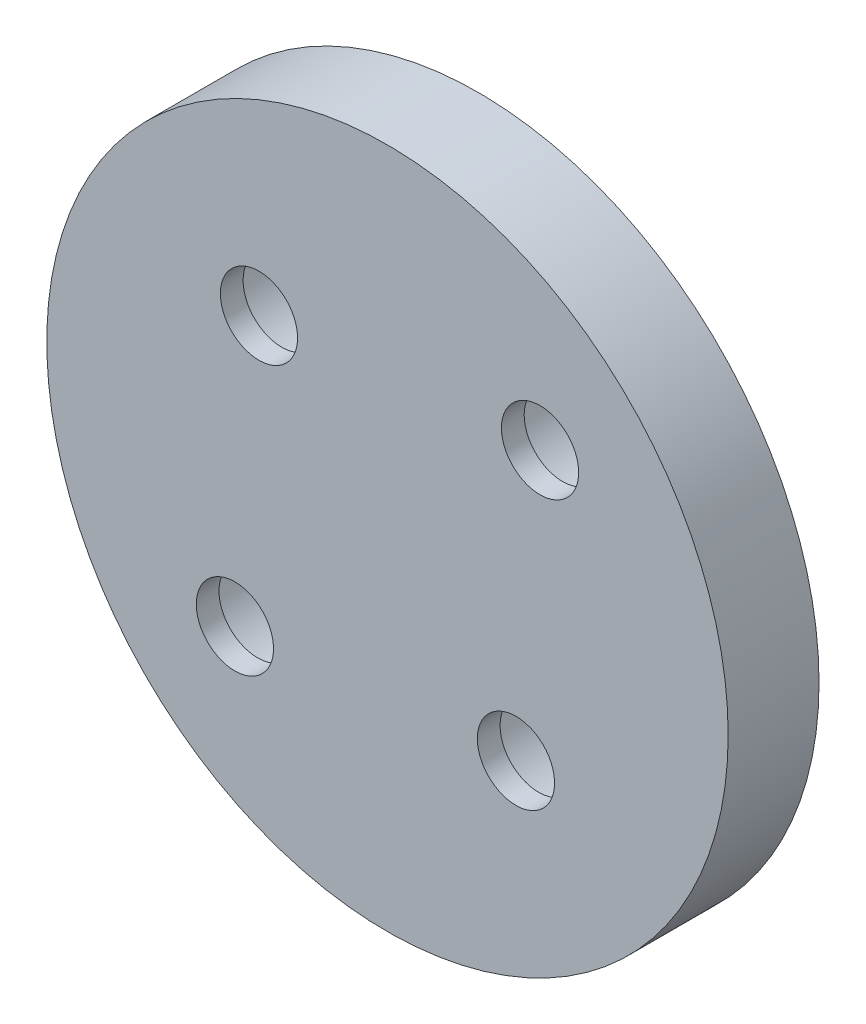
ISO-10303-21;
HEADER;
FILE_DESCRIPTION(('STEP AP214'),'2;1');
FILE_NAME('part.step','',(''),(''),'','','');
FILE_SCHEMA(('AUTOMOTIVE_DESIGN { 1 0 10303 214 1 1 1 1 }'));
ENDSEC;
DATA;
#1=APPLICATION_CONTEXT('core data for automotive mechanical design processes');
#2=APPLICATION_PROTOCOL_DEFINITION('international standard','automotive_design',2000,#1);
#3=PRODUCT_CONTEXT('',#1,'mechanical');
#4=PRODUCT('Part','Part','',(#3));
#5=PRODUCT_RELATED_PRODUCT_CATEGORY('part','',(#4));
#6=PRODUCT_DEFINITION_FORMATION('','',#4);
#7=PRODUCT_DEFINITION_CONTEXT('part definition',#1,'design');
#8=PRODUCT_DEFINITION('design','',#6,#7);
#9=PRODUCT_DEFINITION_SHAPE('','',#8);
#10=(LENGTH_UNIT() NAMED_UNIT(*) SI_UNIT(.MILLI.,.METRE.));
#11=(NAMED_UNIT(*) PLANE_ANGLE_UNIT() SI_UNIT($,.RADIAN.));
#12=(NAMED_UNIT(*) SI_UNIT($,.STERADIAN.) SOLID_ANGLE_UNIT());
#13=UNCERTAINTY_MEASURE_WITH_UNIT(LENGTH_MEASURE(1.E-05),#10,'distance_accuracy_value','');
#14=(GEOMETRIC_REPRESENTATION_CONTEXT(3) GLOBAL_UNCERTAINTY_ASSIGNED_CONTEXT((#13)) GLOBAL_UNIT_ASSIGNED_CONTEXT((#10,
#11,#12)) REPRESENTATION_CONTEXT('',''));
#15=CARTESIAN_POINT('',(0.,0.,0.));
#16=DIRECTION('',(0.,0.,1.));
#17=DIRECTION('',(1.,0.,0.));
#18=AXIS2_PLACEMENT_3D('',#15,#16,#17);
#19=CARTESIAN_POINT('',(1.5,-7.5,-2.));
#20=DIRECTION('',(0.,-1.,0.));
#21=DIRECTION('',(0.,0.,-1.));
#22=AXIS2_PLACEMENT_3D('',#19,#20,#21);
#23=PLANE('',#22);
#24=DIRECTION('',(-1.,0.,0.));
#25=VECTOR('',#24,1.);
#26=CARTESIAN_POINT('',(1.5,-7.5,-1.));
#27=LINE('',#26,#25);
#28=CARTESIAN_POINT('',(1.5,-7.5,-1.));
#29=VERTEX_POINT('',#28);
#30=CARTESIAN_POINT('',(0.499999999999999,-7.5,-1.));
#31=VERTEX_POINT('',#30);
#32=EDGE_CURVE('E103',#29,#31,#27,.T.);
#33=ORIENTED_EDGE('',*,*,#32,.T.);
#34=DIRECTION('',(0.,0.,1.));
#35=VECTOR('',#34,1.);
#36=CARTESIAN_POINT('',(0.499999999999999,-7.5,-1.));
#37=LINE('',#36,#35);
#38=CARTESIAN_POINT('',(0.499999999999999,-7.5,0.));
#39=VERTEX_POINT('',#38);
#40=EDGE_CURVE('E471',#31,#39,#37,.T.);
#41=ORIENTED_EDGE('',*,*,#40,.T.);
#42=DIRECTION('',(1.,0.,0.));
#43=VECTOR('',#42,1.);
#44=CARTESIAN_POINT('',(1.5,-7.5,0.));
#45=LINE('',#44,#43);
#46=CARTESIAN_POINT('',(-0.500000000000001,-7.5,0.));
#47=VERTEX_POINT('',#46);
#48=EDGE_CURVE('E130',#47,#39,#45,.T.);
#49=ORIENTED_EDGE('',*,*,#48,.F.);
#50=DIRECTION('',(0.,0.,1.));
#51=VECTOR('',#50,1.);
#52=CARTESIAN_POINT('',(-0.500000000000001,-7.5,-1.));
#53=LINE('',#52,#51);
#54=CARTESIAN_POINT('',(-0.500000000000001,-7.5,-1.));
#55=VERTEX_POINT('',#54);
#56=EDGE_CURVE('E495',#55,#47,#53,.T.);
#57=ORIENTED_EDGE('',*,*,#56,.F.);
#58=DIRECTION('',(-1.,0.,0.));
#59=VECTOR('',#58,1.);
#60=CARTESIAN_POINT('',(-1.5,-7.5,-1.));
#61=LINE('',#60,#59);
#62=CARTESIAN_POINT('',(-1.5,-7.5,-1.));
#63=VERTEX_POINT('',#62);
#64=EDGE_CURVE('E497',#55,#63,#61,.T.);
#65=ORIENTED_EDGE('',*,*,#64,.T.);
#66=DIRECTION('',(0.,0.,1.));
#67=VECTOR('',#66,1.);
#68=CARTESIAN_POINT('',(-1.5,-7.5,-2.));
#69=LINE('',#68,#67);
#70=CARTESIAN_POINT('',(-1.5,-7.5,-2.));
#71=VERTEX_POINT('',#70);
#72=EDGE_CURVE('E121',#71,#63,#69,.T.);
#73=ORIENTED_EDGE('',*,*,#72,.F.);
#74=DIRECTION('',(1.,0.,0.));
#75=VECTOR('',#74,1.);
#76=CARTESIAN_POINT('',(1.5,-7.5,-2.));
#77=LINE('',#76,#75);
#78=CARTESIAN_POINT('',(1.5,-7.5,-2.));
#79=VERTEX_POINT('',#78);
#80=EDGE_CURVE('E119',#71,#79,#77,.T.);
#81=ORIENTED_EDGE('',*,*,#80,.T.);
#82=DIRECTION('',(0.,0.,1.));
#83=VECTOR('',#82,1.);
#84=CARTESIAN_POINT('',(1.5,-7.5,-2.));
#85=LINE('',#84,#83);
#86=EDGE_CURVE('E59',#79,#29,#85,.T.);
#87=ORIENTED_EDGE('',*,*,#86,.T.);
#88=EDGE_LOOP('',(#33,#41,#49,#57,#65,#73,#81,#87));
#89=FACE_BOUND('',#88,.T.);
#90=ADVANCED_FACE('F34',(#89),#23,.T.);
#91=CARTESIAN_POINT('',(-1.5,7.5,-2.));
#92=DIRECTION('',(-1.,0.,0.));
#93=DIRECTION('',(0.,-1.,0.));
#94=AXIS2_PLACEMENT_3D('',#91,#92,#93);
#95=PLANE('',#94);
#96=ORIENTED_EDGE('',*,*,#72,.T.);
#97=DIRECTION('',(0.,1.,0.));
#98=VECTOR('',#97,1.);
#99=CARTESIAN_POINT('',(-1.5,7.5,-1.));
#100=LINE('',#99,#98);
#101=CARTESIAN_POINT('',(-1.5,7.5,-1.));
#102=VERTEX_POINT('',#101);
#103=EDGE_CURVE('E499',#63,#102,#100,.T.);
#104=ORIENTED_EDGE('',*,*,#103,.T.);
#105=DIRECTION('',(0.,0.,1.));
#106=VECTOR('',#105,1.);
#107=CARTESIAN_POINT('',(-1.5,7.5,-2.));
#108=LINE('',#107,#106);
#109=CARTESIAN_POINT('',(-1.5,7.5,-2.));
#110=VERTEX_POINT('',#109);
#111=EDGE_CURVE('E127',#110,#102,#108,.T.);
#112=ORIENTED_EDGE('',*,*,#111,.F.);
#113=DIRECTION('',(0.,-1.,0.));
#114=VECTOR('',#113,1.);
#115=CARTESIAN_POINT('',(-1.5,7.5,-2.));
#116=LINE('',#115,#114);
#117=EDGE_CURVE('E488',#110,#71,#116,.T.);
#118=ORIENTED_EDGE('',*,*,#117,.T.);
#119=EDGE_LOOP('',(#96,#104,#112,#118));
#120=FACE_BOUND('',#119,.T.);
#121=ADVANCED_FACE('F220',(#120),#95,.T.);
#122=CARTESIAN_POINT('',(1.5,7.5,-2.));
#123=DIRECTION('',(0.,1.,0.));
#124=DIRECTION('',(0.,0.,1.));
#125=AXIS2_PLACEMENT_3D('',#122,#123,#124);
#126=PLANE('',#125);
#127=DIRECTION('',(-1.,0.,0.));
#128=VECTOR('',#127,1.);
#129=CARTESIAN_POINT('',(1.5,7.5,0.));
#130=LINE('',#129,#128);
#131=CARTESIAN_POINT('',(0.5,7.5,0.));
#132=VERTEX_POINT('',#131);
#133=CARTESIAN_POINT('',(-0.499999999999999,7.5,0.));
#134=VERTEX_POINT('',#133);
#135=EDGE_CURVE('E479',#132,#134,#130,.T.);
#136=ORIENTED_EDGE('',*,*,#135,.F.);
#137=DIRECTION('',(0.,0.,1.));
#138=VECTOR('',#137,1.);
#139=CARTESIAN_POINT('',(0.500000000000001,7.5,-1.));
#140=LINE('',#139,#138);
#141=CARTESIAN_POINT('',(0.500000000000001,7.5,-1.));
#142=VERTEX_POINT('',#141);
#143=EDGE_CURVE('E51',#142,#132,#140,.T.);
#144=ORIENTED_EDGE('',*,*,#143,.F.);
#145=DIRECTION('',(1.,0.,0.));
#146=VECTOR('',#145,1.);
#147=CARTESIAN_POINT('',(1.5,7.5,-1.));
#148=LINE('',#147,#146);
#149=CARTESIAN_POINT('',(1.5,7.5,-1.));
#150=VERTEX_POINT('',#149);
#151=EDGE_CURVE('E509',#142,#150,#148,.T.);
#152=ORIENTED_EDGE('',*,*,#151,.T.);
#153=DIRECTION('',(0.,0.,1.));
#154=VECTOR('',#153,1.);
#155=CARTESIAN_POINT('',(1.5,7.5,-2.));
#156=LINE('',#155,#154);
#157=CARTESIAN_POINT('',(1.5,7.5,-2.));
#158=VERTEX_POINT('',#157);
#159=EDGE_CURVE('E114',#158,#150,#156,.T.);
#160=ORIENTED_EDGE('',*,*,#159,.F.);
#161=DIRECTION('',(-1.,0.,0.));
#162=VECTOR('',#161,1.);
#163=CARTESIAN_POINT('',(1.5,7.5,-2.));
#164=LINE('',#163,#162);
#165=EDGE_CURVE('E484',#158,#110,#164,.T.);
#166=ORIENTED_EDGE('',*,*,#165,.T.);
#167=ORIENTED_EDGE('',*,*,#111,.T.);
#168=DIRECTION('',(1.,0.,0.));
#169=VECTOR('',#168,1.);
#170=CARTESIAN_POINT('',(-1.5,7.5,-1.));
#171=LINE('',#170,#169);
#172=CARTESIAN_POINT('',(-0.499999999999999,7.5,-1.));
#173=VERTEX_POINT('',#172);
#174=EDGE_CURVE('E504',#102,#173,#171,.T.);
#175=ORIENTED_EDGE('',*,*,#174,.T.);
#176=DIRECTION('',(0.,0.,1.));
#177=VECTOR('',#176,1.);
#178=CARTESIAN_POINT('',(-0.499999999999999,7.5,-1.));
#179=LINE('',#178,#177);
#180=EDGE_CURVE('E475',#173,#134,#179,.T.);
#181=ORIENTED_EDGE('',*,*,#180,.T.);
#182=EDGE_LOOP('',(#136,#144,#152,#160,#166,#167,#175,#181));
#183=FACE_BOUND('',#182,.T.);
#184=ADVANCED_FACE('F212',(#183),#126,.T.);
#185=CARTESIAN_POINT('',(0.,0.,4.));
#186=DIRECTION('',(0.,0.,-1.));
#187=DIRECTION('',(-1.,0.,0.));
#188=AXIS2_PLACEMENT_3D('',#185,#186,#187);
#189=CYLINDRICAL_SURFACE('',#188,15.);
#190=CARTESIAN_POINT('',(0.,0.,4.));
#191=DIRECTION('',(0.,0.,1.));
#192=DIRECTION('',(1.,0.,0.));
#193=AXIS2_PLACEMENT_3D('',#190,#191,#192);
#194=CIRCLE('',#193,15.);
#195=CARTESIAN_POINT('',(15.,0.,4.));
#196=VERTEX_POINT('',#195);
#197=EDGE_CURVE('E11',#196,#196,#194,.T.);
#198=ORIENTED_EDGE('',*,*,#197,.F.);
#199=EDGE_LOOP('',(#198));
#200=FACE_BOUND('',#199,.T.);
#201=CARTESIAN_POINT('',(0.,0.,0.));
#202=DIRECTION('',(0.,0.,1.));
#203=DIRECTION('',(1.,0.,0.));
#204=AXIS2_PLACEMENT_3D('',#201,#202,#203);
#205=CIRCLE('',#204,15.);
#206=CARTESIAN_POINT('',(15.,0.,0.));
#207=VERTEX_POINT('',#206);
#208=EDGE_CURVE('E43',#207,#207,#205,.T.);
#209=ORIENTED_EDGE('',*,*,#208,.T.);
#210=EDGE_LOOP('',(#209));
#211=FACE_BOUND('',#210,.T.);
#212=ADVANCED_FACE('F36',(#200,#211),#189,.T.);
#213=CARTESIAN_POINT('',(0.,0.,4.));
#214=DIRECTION('',(0.,0.,1.));
#215=DIRECTION('',(1.,0.,0.));
#216=AXIS2_PLACEMENT_3D('',#213,#214,#215);
#217=PLANE('',#216);
#218=CARTESIAN_POINT('',(5.65685424949235,-5.65685424949241,4.));
#219=DIRECTION('',(0.,0.,-1.));
#220=DIRECTION('',(-1.,0.,0.));
#221=AXIS2_PLACEMENT_3D('',#218,#219,#220);
#222=CIRCLE('',#221,1.7);
#223=CARTESIAN_POINT('',(3.95685424949235,-5.65685424949241,4.));
#224=VERTEX_POINT('',#223);
#225=EDGE_CURVE('E137',#224,#224,#222,.T.);
#226=ORIENTED_EDGE('',*,*,#225,.T.);
#227=EDGE_LOOP('',(#226));
#228=FACE_BOUND('',#227,.T.);
#229=CARTESIAN_POINT('',(-6.71751442127221,-6.71751442127219,4.));
#230=DIRECTION('',(0.,0.,-1.));
#231=DIRECTION('',(-1.,0.,0.));
#232=AXIS2_PLACEMENT_3D('',#229,#230,#231);
#233=CIRCLE('',#232,1.7);
#234=CARTESIAN_POINT('',(-8.41751442127221,-6.71751442127219,4.));
#235=VERTEX_POINT('',#234);
#236=EDGE_CURVE('E143',#235,#235,#233,.T.);
#237=ORIENTED_EDGE('',*,*,#236,.T.);
#238=EDGE_LOOP('',(#237));
#239=FACE_BOUND('',#238,.T.);
#240=CARTESIAN_POINT('',(-5.65685424949235,5.65685424949241,4.));
#241=DIRECTION('',(0.,0.,-1.));
#242=DIRECTION('',(-1.,0.,0.));
#243=AXIS2_PLACEMENT_3D('',#240,#241,#242);
#244=CIRCLE('',#243,1.7);
#245=CARTESIAN_POINT('',(-7.35685424949235,5.65685424949241,4.));
#246=VERTEX_POINT('',#245);
#247=EDGE_CURVE('E139',#246,#246,#244,.T.);
#248=ORIENTED_EDGE('',*,*,#247,.T.);
#249=EDGE_LOOP('',(#248));
#250=FACE_BOUND('',#249,.T.);
#251=CARTESIAN_POINT('',(6.71751442127221,6.71751442127219,4.));
#252=DIRECTION('',(0.,0.,-1.));
#253=DIRECTION('',(-1.,0.,0.));
#254=AXIS2_PLACEMENT_3D('',#251,#252,#253);
#255=CIRCLE('',#254,1.7);
#256=CARTESIAN_POINT('',(5.01751442127221,6.71751442127219,4.));
#257=VERTEX_POINT('',#256);
#258=EDGE_CURVE('E142',#257,#257,#255,.T.);
#259=ORIENTED_EDGE('',*,*,#258,.T.);
#260=EDGE_LOOP('',(#259));
#261=FACE_BOUND('',#260,.T.);
#262=ORIENTED_EDGE('',*,*,#197,.T.);
#263=EDGE_LOOP('',(#262));
#264=FACE_BOUND('',#263,.T.);
#265=ADVANCED_FACE('F207',(#228,#239,#250,#261,#264),#217,.T.);
#266=CARTESIAN_POINT('',(0.,0.,0.));
#267=DIRECTION('',(0.,0.,1.));
#268=DIRECTION('',(1.,0.,0.));
#269=AXIS2_PLACEMENT_3D('',#266,#267,#268);
#270=PLANE('',#269);
#271=ORIENTED_EDGE('',*,*,#48,.T.);
#272=DIRECTION('',(0.,1.,0.));
#273=VECTOR('',#272,1.);
#274=CARTESIAN_POINT('',(0.500000000000001,7.5,0.));
#275=LINE('',#274,#273);
#276=EDGE_CURVE('E115',#39,#132,#275,.T.);
#277=ORIENTED_EDGE('',*,*,#276,.T.);
#278=ORIENTED_EDGE('',*,*,#135,.T.);
#279=DIRECTION('',(0.,-1.,0.));
#280=VECTOR('',#279,1.);
#281=CARTESIAN_POINT('',(-0.499999999999999,7.5,0.));
#282=LINE('',#281,#280);
#283=EDGE_CURVE('E481',#134,#47,#282,.T.);
#284=ORIENTED_EDGE('',*,*,#283,.T.);
#285=EDGE_LOOP('',(#271,#277,#278,#284));
#286=FACE_BOUND('',#285,.T.);
#287=CARTESIAN_POINT('',(-5.65685424949235,5.65685424949241,0.));
#288=DIRECTION('',(0.,0.,-1.));
#289=DIRECTION('',(-1.,0.,0.));
#290=AXIS2_PLACEMENT_3D('',#287,#288,#289);
#291=CIRCLE('',#290,3.25);
#292=CARTESIAN_POINT('',(-8.90685424949235,5.65685424949241,0.));
#293=VERTEX_POINT('',#292);
#294=EDGE_CURVE('E167',#293,#293,#291,.T.);
#295=ORIENTED_EDGE('',*,*,#294,.F.);
#296=EDGE_LOOP('',(#295));
#297=FACE_BOUND('',#296,.T.);
#298=CARTESIAN_POINT('',(5.65685424949235,-5.65685424949241,0.));
#299=DIRECTION('',(0.,0.,-1.));
#300=DIRECTION('',(-1.,0.,0.));
#301=AXIS2_PLACEMENT_3D('',#298,#299,#300);
#302=CIRCLE('',#301,3.25);
#303=CARTESIAN_POINT('',(2.40685424949235,-5.65685424949241,0.));
#304=VERTEX_POINT('',#303);
#305=EDGE_CURVE('E161',#304,#304,#302,.T.);
#306=ORIENTED_EDGE('',*,*,#305,.F.);
#307=EDGE_LOOP('',(#306));
#308=FACE_BOUND('',#307,.T.);
#309=CARTESIAN_POINT('',(-6.71751442127221,-6.71751442127219,0.));
#310=DIRECTION('',(0.,0.,-1.));
#311=DIRECTION('',(-1.,0.,0.));
#312=AXIS2_PLACEMENT_3D('',#309,#310,#311);
#313=CIRCLE('',#312,3.25);
#314=CARTESIAN_POINT('',(-9.96751442127221,-6.71751442127219,0.));
#315=VERTEX_POINT('',#314);
#316=EDGE_CURVE('E155',#315,#315,#313,.T.);
#317=ORIENTED_EDGE('',*,*,#316,.F.);
#318=EDGE_LOOP('',(#317));
#319=FACE_BOUND('',#318,.T.);
#320=CARTESIAN_POINT('',(6.71751442127221,6.71751442127219,0.));
#321=DIRECTION('',(0.,0.,-1.));
#322=DIRECTION('',(-1.,0.,0.));
#323=AXIS2_PLACEMENT_3D('',#320,#321,#322);
#324=CIRCLE('',#323,3.25);
#325=CARTESIAN_POINT('',(3.46751442127221,6.71751442127219,0.));
#326=VERTEX_POINT('',#325);
#327=EDGE_CURVE('E154',#326,#326,#324,.T.);
#328=ORIENTED_EDGE('',*,*,#327,.F.);
#329=EDGE_LOOP('',(#328));
#330=FACE_BOUND('',#329,.T.);
#331=ORIENTED_EDGE('',*,*,#208,.F.);
#332=EDGE_LOOP('',(#331));
#333=FACE_BOUND('',#332,.T.);
#334=ADVANCED_FACE('F201',(#286,#297,#308,#319,#330,#333),#270,.F.);
#335=CARTESIAN_POINT('',(6.71751442127221,6.71751442127219,3.));
#336=DIRECTION('',(0.,0.,-1.));
#337=DIRECTION('',(-1.,0.,0.));
#338=AXIS2_PLACEMENT_3D('',#335,#336,#337);
#339=CYLINDRICAL_SURFACE('',#338,3.25);
#340=CARTESIAN_POINT('',(6.71751442127221,6.71751442127219,3.));
#341=DIRECTION('',(0.,0.,-1.));
#342=DIRECTION('',(-1.,0.,0.));
#343=AXIS2_PLACEMENT_3D('',#340,#341,#342);
#344=CIRCLE('',#343,3.25);
#345=CARTESIAN_POINT('',(3.46751442127221,6.71751442127219,3.));
#346=VERTEX_POINT('',#345);
#347=EDGE_CURVE('E170',#346,#346,#344,.T.);
#348=ORIENTED_EDGE('',*,*,#347,.F.);
#349=EDGE_LOOP('',(#348));
#350=FACE_BOUND('',#349,.T.);
#351=ORIENTED_EDGE('',*,*,#327,.T.);
#352=EDGE_LOOP('',(#351));
#353=FACE_BOUND('',#352,.T.);
#354=ADVANCED_FACE('F195',(#350,#353),#339,.F.);
#355=CARTESIAN_POINT('',(6.71751442127221,6.71751442127219,3.));
#356=DIRECTION('',(0.,0.,-1.));
#357=DIRECTION('',(-1.,0.,0.));
#358=AXIS2_PLACEMENT_3D('',#355,#356,#357);
#359=PLANE('',#358);
#360=CARTESIAN_POINT('',(6.71751442127221,6.71751442127219,3.));
#361=DIRECTION('',(0.,0.,-1.));
#362=DIRECTION('',(-1.,0.,0.));
#363=AXIS2_PLACEMENT_3D('',#360,#361,#362);
#364=CIRCLE('',#363,1.7);
#365=CARTESIAN_POINT('',(5.01751442127221,6.71751442127219,3.));
#366=VERTEX_POINT('',#365);
#367=EDGE_CURVE('E38',#366,#366,#364,.T.);
#368=ORIENTED_EDGE('',*,*,#367,.F.);
#369=EDGE_LOOP('',(#368));
#370=FACE_BOUND('',#369,.T.);
#371=ORIENTED_EDGE('',*,*,#347,.T.);
#372=EDGE_LOOP('',(#371));
#373=FACE_BOUND('',#372,.T.);
#374=ADVANCED_FACE('F191',(#370,#373),#359,.T.);
#375=CARTESIAN_POINT('',(-6.71751442127221,-6.71751442127219,3.));
#376=DIRECTION('',(0.,0.,-1.));
#377=DIRECTION('',(-1.,0.,0.));
#378=AXIS2_PLACEMENT_3D('',#375,#376,#377);
#379=CYLINDRICAL_SURFACE('',#378,3.25);
#380=CARTESIAN_POINT('',(-6.71751442127221,-6.71751442127219,3.));
#381=DIRECTION('',(0.,0.,-1.));
#382=DIRECTION('',(-1.,0.,0.));
#383=AXIS2_PLACEMENT_3D('',#380,#381,#382);
#384=CIRCLE('',#383,3.25);
#385=CARTESIAN_POINT('',(-9.96751442127221,-6.71751442127219,3.));
#386=VERTEX_POINT('',#385);
#387=EDGE_CURVE('E151',#386,#386,#384,.T.);
#388=ORIENTED_EDGE('',*,*,#387,.F.);
#389=EDGE_LOOP('',(#388));
#390=FACE_BOUND('',#389,.T.);
#391=ORIENTED_EDGE('',*,*,#316,.T.);
#392=EDGE_LOOP('',(#391));
#393=FACE_BOUND('',#392,.T.);
#394=ADVANCED_FACE('F194',(#390,#393),#379,.F.);
#395=CARTESIAN_POINT('',(-6.71751442127221,-6.71751442127219,3.));
#396=DIRECTION('',(0.,0.,-1.));
#397=DIRECTION('',(-1.,0.,0.));
#398=AXIS2_PLACEMENT_3D('',#395,#396,#397);
#399=PLANE('',#398);
#400=CARTESIAN_POINT('',(-6.71751442127221,-6.71751442127219,3.));
#401=DIRECTION('',(0.,0.,-1.));
#402=DIRECTION('',(-1.,0.,0.));
#403=AXIS2_PLACEMENT_3D('',#400,#401,#402);
#404=CIRCLE('',#403,1.7);
#405=CARTESIAN_POINT('',(-8.41751442127221,-6.71751442127219,3.));
#406=VERTEX_POINT('',#405);
#407=EDGE_CURVE('E181',#406,#406,#404,.T.);
#408=ORIENTED_EDGE('',*,*,#407,.F.);
#409=EDGE_LOOP('',(#408));
#410=FACE_BOUND('',#409,.T.);
#411=ORIENTED_EDGE('',*,*,#387,.T.);
#412=EDGE_LOOP('',(#411));
#413=FACE_BOUND('',#412,.T.);
#414=ADVANCED_FACE('F264',(#410,#413),#399,.T.);
#415=CARTESIAN_POINT('',(5.65685424949235,-5.65685424949241,3.));
#416=DIRECTION('',(0.,0.,-1.));
#417=DIRECTION('',(-1.,0.,0.));
#418=AXIS2_PLACEMENT_3D('',#415,#416,#417);
#419=CYLINDRICAL_SURFACE('',#418,3.25);
#420=CARTESIAN_POINT('',(5.65685424949235,-5.65685424949241,3.));
#421=DIRECTION('',(0.,0.,-1.));
#422=DIRECTION('',(-1.,0.,0.));
#423=AXIS2_PLACEMENT_3D('',#420,#421,#422);
#424=CIRCLE('',#423,3.25);
#425=CARTESIAN_POINT('',(2.40685424949235,-5.65685424949241,3.));
#426=VERTEX_POINT('',#425);
#427=EDGE_CURVE('E158',#426,#426,#424,.T.);
#428=ORIENTED_EDGE('',*,*,#427,.F.);
#429=EDGE_LOOP('',(#428));
#430=FACE_BOUND('',#429,.T.);
#431=ORIENTED_EDGE('',*,*,#305,.T.);
#432=EDGE_LOOP('',(#431));
#433=FACE_BOUND('',#432,.T.);
#434=ADVANCED_FACE('F267',(#430,#433),#419,.F.);
#435=CARTESIAN_POINT('',(5.65685424949235,-5.65685424949241,3.));
#436=DIRECTION('',(0.,0.,-1.));
#437=DIRECTION('',(-1.,0.,0.));
#438=AXIS2_PLACEMENT_3D('',#435,#436,#437);
#439=PLANE('',#438);
#440=CARTESIAN_POINT('',(5.65685424949235,-5.65685424949241,3.));
#441=DIRECTION('',(0.,0.,-1.));
#442=DIRECTION('',(-1.,0.,0.));
#443=AXIS2_PLACEMENT_3D('',#440,#441,#442);
#444=CIRCLE('',#443,1.7);
#445=CARTESIAN_POINT('',(3.95685424949235,-5.65685424949241,3.));
#446=VERTEX_POINT('',#445);
#447=EDGE_CURVE('E179',#446,#446,#444,.T.);
#448=ORIENTED_EDGE('',*,*,#447,.F.);
#449=EDGE_LOOP('',(#448));
#450=FACE_BOUND('',#449,.T.);
#451=ORIENTED_EDGE('',*,*,#427,.T.);
#452=EDGE_LOOP('',(#451));
#453=FACE_BOUND('',#452,.T.);
#454=ADVANCED_FACE('F272',(#450,#453),#439,.T.);
#455=CARTESIAN_POINT('',(-5.65685424949235,5.65685424949241,3.));
#456=DIRECTION('',(0.,0.,-1.));
#457=DIRECTION('',(-1.,0.,0.));
#458=AXIS2_PLACEMENT_3D('',#455,#456,#457);
#459=CYLINDRICAL_SURFACE('',#458,3.25);
#460=CARTESIAN_POINT('',(-5.65685424949235,5.65685424949241,3.));
#461=DIRECTION('',(0.,0.,-1.));
#462=DIRECTION('',(-1.,0.,0.));
#463=AXIS2_PLACEMENT_3D('',#460,#461,#462);
#464=CIRCLE('',#463,3.25);
#465=CARTESIAN_POINT('',(-8.90685424949235,5.65685424949241,3.));
#466=VERTEX_POINT('',#465);
#467=EDGE_CURVE('E164',#466,#466,#464,.T.);
#468=ORIENTED_EDGE('',*,*,#467,.F.);
#469=EDGE_LOOP('',(#468));
#470=FACE_BOUND('',#469,.T.);
#471=ORIENTED_EDGE('',*,*,#294,.T.);
#472=EDGE_LOOP('',(#471));
#473=FACE_BOUND('',#472,.T.);
#474=ADVANCED_FACE('F275',(#470,#473),#459,.F.);
#475=CARTESIAN_POINT('',(-5.65685424949235,5.65685424949241,3.));
#476=DIRECTION('',(0.,0.,-1.));
#477=DIRECTION('',(-1.,0.,0.));
#478=AXIS2_PLACEMENT_3D('',#475,#476,#477);
#479=PLANE('',#478);
#480=CARTESIAN_POINT('',(-5.65685424949235,5.65685424949241,3.));
#481=DIRECTION('',(0.,0.,-1.));
#482=DIRECTION('',(-1.,0.,0.));
#483=AXIS2_PLACEMENT_3D('',#480,#481,#482);
#484=CIRCLE('',#483,1.7);
#485=CARTESIAN_POINT('',(-7.35685424949235,5.65685424949241,3.));
#486=VERTEX_POINT('',#485);
#487=EDGE_CURVE('E150',#486,#486,#484,.T.);
#488=ORIENTED_EDGE('',*,*,#487,.F.);
#489=EDGE_LOOP('',(#488));
#490=FACE_BOUND('',#489,.T.);
#491=ORIENTED_EDGE('',*,*,#467,.T.);
#492=EDGE_LOOP('',(#491));
#493=FACE_BOUND('',#492,.T.);
#494=ADVANCED_FACE('F254',(#490,#493),#479,.T.);
#495=CARTESIAN_POINT('',(-5.65685424949235,5.65685424949241,4.));
#496=DIRECTION('',(0.,0.,-1.));
#497=DIRECTION('',(-1.,0.,0.));
#498=AXIS2_PLACEMENT_3D('',#495,#496,#497);
#499=CYLINDRICAL_SURFACE('',#498,1.7);
#500=ORIENTED_EDGE('',*,*,#487,.T.);
#501=EDGE_LOOP('',(#500));
#502=FACE_BOUND('',#501,.T.);
#503=ORIENTED_EDGE('',*,*,#247,.F.);
#504=EDGE_LOOP('',(#503));
#505=FACE_BOUND('',#504,.T.);
#506=ADVANCED_FACE('F250',(#502,#505),#499,.F.);
#507=CARTESIAN_POINT('',(5.65685424949235,-5.65685424949241,4.));
#508=DIRECTION('',(0.,0.,-1.));
#509=DIRECTION('',(-1.,0.,0.));
#510=AXIS2_PLACEMENT_3D('',#507,#508,#509);
#511=CYLINDRICAL_SURFACE('',#510,1.7);
#512=ORIENTED_EDGE('',*,*,#447,.T.);
#513=EDGE_LOOP('',(#512));
#514=FACE_BOUND('',#513,.T.);
#515=ORIENTED_EDGE('',*,*,#225,.F.);
#516=EDGE_LOOP('',(#515));
#517=FACE_BOUND('',#516,.T.);
#518=ADVANCED_FACE('F253',(#514,#517),#511,.F.);
#519=CARTESIAN_POINT('',(-6.71751442127221,-6.71751442127219,4.));
#520=DIRECTION('',(0.,0.,-1.));
#521=DIRECTION('',(-1.,0.,0.));
#522=AXIS2_PLACEMENT_3D('',#519,#520,#521);
#523=CYLINDRICAL_SURFACE('',#522,1.7);
#524=ORIENTED_EDGE('',*,*,#407,.T.);
#525=EDGE_LOOP('',(#524));
#526=FACE_BOUND('',#525,.T.);
#527=ORIENTED_EDGE('',*,*,#236,.F.);
#528=EDGE_LOOP('',(#527));
#529=FACE_BOUND('',#528,.T.);
#530=ADVANCED_FACE('F256',(#526,#529),#523,.F.);
#531=CARTESIAN_POINT('',(6.71751442127221,6.71751442127219,4.));
#532=DIRECTION('',(0.,0.,-1.));
#533=DIRECTION('',(-1.,0.,0.));
#534=AXIS2_PLACEMENT_3D('',#531,#532,#533);
#535=CYLINDRICAL_SURFACE('',#534,1.7);
#536=ORIENTED_EDGE('',*,*,#367,.T.);
#537=EDGE_LOOP('',(#536));
#538=FACE_BOUND('',#537,.T.);
#539=ORIENTED_EDGE('',*,*,#258,.F.);
#540=EDGE_LOOP('',(#539));
#541=FACE_BOUND('',#540,.T.);
#542=ADVANCED_FACE('F188',(#538,#541),#535,.F.);
#543=CARTESIAN_POINT('',(1.5,7.5,-2.));
#544=DIRECTION('',(1.,0.,0.));
#545=DIRECTION('',(0.,1.,0.));
#546=AXIS2_PLACEMENT_3D('',#543,#544,#545);
#547=PLANE('',#546);
#548=DIRECTION('',(0.,-1.,0.));
#549=VECTOR('',#548,1.);
#550=CARTESIAN_POINT('',(1.5,7.5,-1.));
#551=LINE('',#550,#549);
#552=EDGE_CURVE('E106',#150,#29,#551,.T.);
#553=ORIENTED_EDGE('',*,*,#552,.T.);
#554=ORIENTED_EDGE('',*,*,#86,.F.);
#555=DIRECTION('',(0.,1.,0.));
#556=VECTOR('',#555,1.);
#557=CARTESIAN_POINT('',(1.5,7.5,-2.));
#558=LINE('',#557,#556);
#559=EDGE_CURVE('E483',#79,#158,#558,.T.);
#560=ORIENTED_EDGE('',*,*,#559,.T.);
#561=ORIENTED_EDGE('',*,*,#159,.T.);
#562=EDGE_LOOP('',(#553,#554,#560,#561));
#563=FACE_BOUND('',#562,.T.);
#564=ADVANCED_FACE('F113',(#563),#547,.T.);
#565=CARTESIAN_POINT('',(0.,0.,-2.));
#566=DIRECTION('',(0.,0.,-1.));
#567=DIRECTION('',(-1.,0.,0.));
#568=AXIS2_PLACEMENT_3D('',#565,#566,#567);
#569=PLANE('',#568);
#570=ORIENTED_EDGE('',*,*,#559,.F.);
#571=ORIENTED_EDGE('',*,*,#80,.F.);
#572=ORIENTED_EDGE('',*,*,#117,.F.);
#573=ORIENTED_EDGE('',*,*,#165,.F.);
#574=EDGE_LOOP('',(#570,#571,#572,#573));
#575=FACE_BOUND('',#574,.T.);
#576=ADVANCED_FACE('F232',(#575),#569,.T.);
#577=CARTESIAN_POINT('',(-0.499999999999999,7.5,-1.));
#578=DIRECTION('',(-1.,0.,0.));
#579=DIRECTION('',(0.,-1.,0.));
#580=AXIS2_PLACEMENT_3D('',#577,#578,#579);
#581=PLANE('',#580);
#582=ORIENTED_EDGE('',*,*,#283,.F.);
#583=ORIENTED_EDGE('',*,*,#180,.F.);
#584=DIRECTION('',(0.,-1.,0.));
#585=VECTOR('',#584,1.);
#586=CARTESIAN_POINT('',(-0.499999999999999,7.5,-1.));
#587=LINE('',#586,#585);
#588=EDGE_CURVE('E502',#173,#55,#587,.T.);
#589=ORIENTED_EDGE('',*,*,#588,.T.);
#590=ORIENTED_EDGE('',*,*,#56,.T.);
#591=EDGE_LOOP('',(#582,#583,#589,#590));
#592=FACE_BOUND('',#591,.T.);
#593=ADVANCED_FACE('F335',(#592),#581,.T.);
#594=CARTESIAN_POINT('',(0.,0.,-1.));
#595=DIRECTION('',(0.,0.,1.));
#596=DIRECTION('',(1.,0.,0.));
#597=AXIS2_PLACEMENT_3D('',#594,#595,#596);
#598=PLANE('',#597);
#599=ORIENTED_EDGE('',*,*,#103,.F.);
#600=ORIENTED_EDGE('',*,*,#64,.F.);
#601=ORIENTED_EDGE('',*,*,#588,.F.);
#602=ORIENTED_EDGE('',*,*,#174,.F.);
#603=EDGE_LOOP('',(#599,#600,#601,#602));
#604=FACE_BOUND('',#603,.T.);
#605=ADVANCED_FACE('F342',(#604),#598,.T.);
#606=CARTESIAN_POINT('',(0.500000000000001,7.5,-1.));
#607=DIRECTION('',(1.,0.,0.));
#608=DIRECTION('',(0.,1.,0.));
#609=AXIS2_PLACEMENT_3D('',#606,#607,#608);
#610=PLANE('',#609);
#611=ORIENTED_EDGE('',*,*,#276,.F.);
#612=ORIENTED_EDGE('',*,*,#40,.F.);
#613=DIRECTION('',(0.,1.,0.));
#614=VECTOR('',#613,1.);
#615=CARTESIAN_POINT('',(0.500000000000001,7.5,-1.));
#616=LINE('',#615,#614);
#617=EDGE_CURVE('E108',#31,#142,#616,.T.);
#618=ORIENTED_EDGE('',*,*,#617,.T.);
#619=ORIENTED_EDGE('',*,*,#143,.T.);
#620=EDGE_LOOP('',(#611,#612,#618,#619));
#621=FACE_BOUND('',#620,.T.);
#622=ADVANCED_FACE('F349',(#621),#610,.T.);
#623=CARTESIAN_POINT('',(0.,0.,-1.));
#624=DIRECTION('',(0.,0.,-1.));
#625=DIRECTION('',(-1.,0.,0.));
#626=AXIS2_PLACEMENT_3D('',#623,#624,#625);
#627=PLANE('',#626);
#628=ORIENTED_EDGE('',*,*,#552,.F.);
#629=ORIENTED_EDGE('',*,*,#151,.F.);
#630=ORIENTED_EDGE('',*,*,#617,.F.);
#631=ORIENTED_EDGE('',*,*,#32,.F.);
#632=EDGE_LOOP('',(#628,#629,#630,#631));
#633=FACE_BOUND('',#632,.T.);
#634=ADVANCED_FACE('F104',(#633),#627,.F.);
#635=CLOSED_SHELL('',(#90,#121,#184,#212,#265,#334,#354,#374,#394,#414,#434,#454,#474,#494,#506,
#518,#530,#542,#564,#576,#593,#605,#622,#634));
#636=CARTESIAN_POINT('',(0.,0.,1.));
#637=DIRECTION('',(0.,0.,1.));
#638=DIRECTION('',(1.,0.,0.));
#639=AXIS2_PLACEMENT_3D('',#636,#637,#638);
#640=CYLINDRICAL_SURFACE('',#639,2.);
#641=CARTESIAN_POINT('',(0.,0.,1.));
#642=DIRECTION('',(0.,0.,1.));
#643=DIRECTION('',(1.,0.,0.));
#644=AXIS2_PLACEMENT_3D('',#641,#642,#643);
#645=CIRCLE('',#644,2.);
#646=CARTESIAN_POINT('',(2.,0.,1.));
#647=VERTEX_POINT('',#646);
#648=EDGE_CURVE('E124',#647,#647,#645,.T.);
#649=ORIENTED_EDGE('',*,*,#648,.F.);
#650=EDGE_LOOP('',(#649));
#651=FACE_BOUND('',#650,.T.);
#652=CARTESIAN_POINT('',(0.,0.,3.));
#653=DIRECTION('',(0.,0.,1.));
#654=DIRECTION('',(1.,0.,0.));
#655=AXIS2_PLACEMENT_3D('',#652,#653,#654);
#656=CIRCLE('',#655,2.);
#657=CARTESIAN_POINT('',(2.,0.,3.));
#658=VERTEX_POINT('',#657);
#659=EDGE_CURVE('E120',#658,#658,#656,.T.);
#660=ORIENTED_EDGE('',*,*,#659,.T.);
#661=EDGE_LOOP('',(#660));
#662=FACE_BOUND('',#661,.T.);
#663=ADVANCED_FACE('F241',(#651,#662),#640,.F.);
#664=CARTESIAN_POINT('',(0.,0.,1.));
#665=DIRECTION('',(0.,0.,1.));
#666=DIRECTION('',(1.,0.,0.));
#667=AXIS2_PLACEMENT_3D('',#664,#665,#666);
#668=PLANE('',#667);
#669=ORIENTED_EDGE('',*,*,#648,.T.);
#670=EDGE_LOOP('',(#669));
#671=FACE_BOUND('',#670,.T.);
#672=ADVANCED_FACE('F237',(#671),#668,.T.);
#673=CARTESIAN_POINT('',(0.,0.,3.));
#674=DIRECTION('',(0.,0.,1.));
#675=DIRECTION('',(1.,0.,0.));
#676=AXIS2_PLACEMENT_3D('',#673,#674,#675);
#677=PLANE('',#676);
#678=ORIENTED_EDGE('',*,*,#659,.F.);
#679=EDGE_LOOP('',(#678));
#680=FACE_BOUND('',#679,.T.);
#681=ADVANCED_FACE('F240',(#680),#677,.F.);
#682=CLOSED_SHELL('',(#663,#672,#681));
#683=ORIENTED_CLOSED_SHELL('',*,#682,.T.);
#684=BREP_WITH_VOIDS('B2',#635,(#683));
#685=ADVANCED_BREP_SHAPE_REPRESENTATION('',(#18,#684),#14);
#686=SHAPE_DEFINITION_REPRESENTATION(#9,#685);
ENDSEC;
END-ISO-10303-21;
